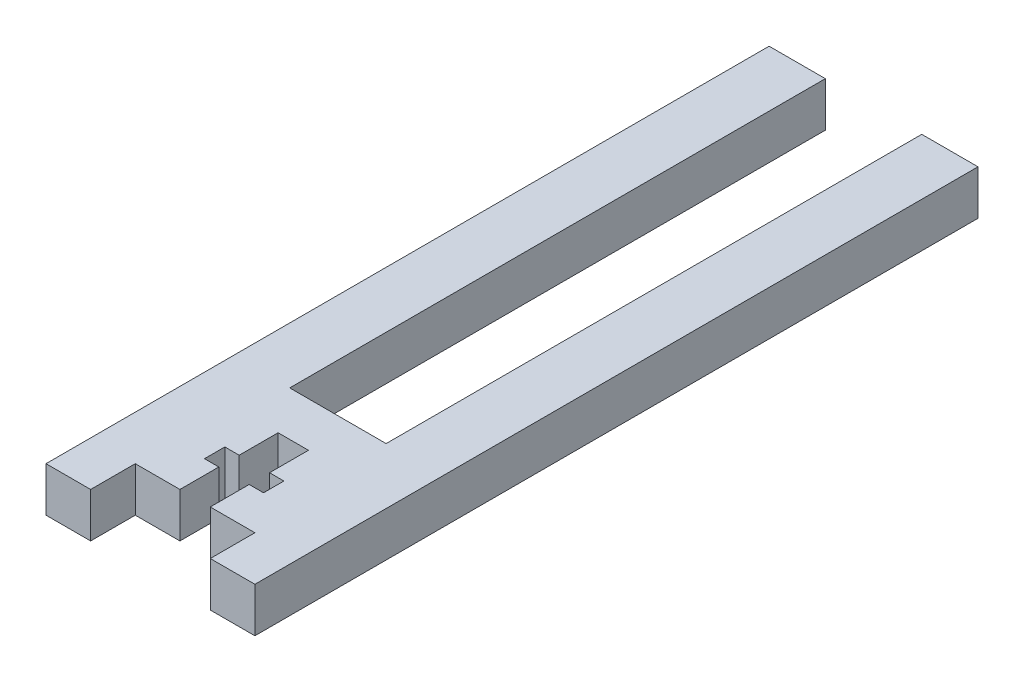
ISO-10303-21;
HEADER;
FILE_DESCRIPTION(('STEP AP214'),'2;1');
FILE_NAME('part.step','',(''),(''),'','','');
FILE_SCHEMA(('AUTOMOTIVE_DESIGN { 1 0 10303 214 1 1 1 1 }'));
ENDSEC;
DATA;
#1=APPLICATION_CONTEXT('core data for automotive mechanical design processes');
#2=APPLICATION_PROTOCOL_DEFINITION('international standard','automotive_design',2000,#1);
#3=PRODUCT_CONTEXT('',#1,'mechanical');
#4=PRODUCT('Part','Part','',(#3));
#5=PRODUCT_RELATED_PRODUCT_CATEGORY('part','',(#4));
#6=PRODUCT_DEFINITION_FORMATION('','',#4);
#7=PRODUCT_DEFINITION_CONTEXT('part definition',#1,'design');
#8=PRODUCT_DEFINITION('design','',#6,#7);
#9=PRODUCT_DEFINITION_SHAPE('','',#8);
#10=(LENGTH_UNIT() NAMED_UNIT(*) SI_UNIT(.MILLI.,.METRE.));
#11=(NAMED_UNIT(*) PLANE_ANGLE_UNIT() SI_UNIT($,.RADIAN.));
#12=(NAMED_UNIT(*) SI_UNIT($,.STERADIAN.) SOLID_ANGLE_UNIT());
#13=UNCERTAINTY_MEASURE_WITH_UNIT(LENGTH_MEASURE(1.E-05),#10,'distance_accuracy_value','');
#14=(GEOMETRIC_REPRESENTATION_CONTEXT(3) GLOBAL_UNCERTAINTY_ASSIGNED_CONTEXT((#13)) GLOBAL_UNIT_ASSIGNED_CONTEXT((#10,
#11,#12)) REPRESENTATION_CONTEXT('',''));
#15=CARTESIAN_POINT('',(0.,0.,0.));
#16=DIRECTION('',(0.,0.,1.));
#17=DIRECTION('',(1.,0.,0.));
#18=AXIS2_PLACEMENT_3D('',#15,#16,#17);
#19=CARTESIAN_POINT('',(0.,6.35,13.97));
#20=DIRECTION('',(0.,0.,1.));
#21=DIRECTION('',(1.,0.,0.));
#22=AXIS2_PLACEMENT_3D('',#19,#20,#21);
#23=PLANE('',#22);
#24=DIRECTION('',(-1.,0.,0.));
#25=VECTOR('',#24,1.);
#26=CARTESIAN_POINT('',(0.,0.,13.97));
#27=LINE('',#26,#25);
#28=CARTESIAN_POINT('',(8.50900000000017,0.,13.9699999999999));
#29=VERTEX_POINT('',#28);
#30=CARTESIAN_POINT('',(2.15900000000017,0.,13.97));
#31=VERTEX_POINT('',#30);
#32=EDGE_CURVE('E222',#29,#31,#27,.T.);
#33=ORIENTED_EDGE('',*,*,#32,.F.);
#34=DIRECTION('',(0.,-1.,0.));
#35=VECTOR('',#34,1.);
#36=CARTESIAN_POINT('',(8.50900000000017,6.35,13.9699999999999));
#37=LINE('',#36,#35);
#38=CARTESIAN_POINT('',(8.50900000000017,6.35,13.9699999999999));
#39=VERTEX_POINT('',#38);
#40=EDGE_CURVE('E11',#39,#29,#37,.T.);
#41=ORIENTED_EDGE('',*,*,#40,.F.);
#42=DIRECTION('',(-1.,0.,0.));
#43=VECTOR('',#42,1.);
#44=CARTESIAN_POINT('',(0.,6.35,13.97));
#45=LINE('',#44,#43);
#46=CARTESIAN_POINT('',(2.15900000000017,6.35,13.97));
#47=VERTEX_POINT('',#46);
#48=EDGE_CURVE('E278',#39,#47,#45,.T.);
#49=ORIENTED_EDGE('',*,*,#48,.T.);
#50=DIRECTION('',(0.,-1.,0.));
#51=VECTOR('',#50,1.);
#52=CARTESIAN_POINT('',(2.15900000000017,6.35,13.97));
#53=LINE('',#52,#51);
#54=EDGE_CURVE('E132',#47,#31,#53,.T.);
#55=ORIENTED_EDGE('',*,*,#54,.T.);
#56=EDGE_LOOP('',(#33,#41,#49,#55));
#57=FACE_BOUND('',#56,.T.);
#58=ADVANCED_FACE('F33',(#57),#23,.T.);
#59=CARTESIAN_POINT('',(8.50900000000008,6.35,0.));
#60=DIRECTION('',(1.,0.,0.));
#61=DIRECTION('',(0.,0.,-1.));
#62=AXIS2_PLACEMENT_3D('',#59,#60,#61);
#63=PLANE('',#62);
#64=DIRECTION('',(0.,0.,1.));
#65=VECTOR('',#64,1.);
#66=CARTESIAN_POINT('',(8.50900000000008,0.,0.));
#67=LINE('',#66,#65);
#68=CARTESIAN_POINT('',(8.50900000000021,0.,20.3199999999999));
#69=VERTEX_POINT('',#68);
#70=EDGE_CURVE('E225',#29,#69,#67,.T.);
#71=ORIENTED_EDGE('',*,*,#70,.T.);
#72=DIRECTION('',(0.,-1.,0.));
#73=VECTOR('',#72,1.);
#74=CARTESIAN_POINT('',(8.50900000000021,6.35,20.3199999999999));
#75=LINE('',#74,#73);
#76=CARTESIAN_POINT('',(8.50900000000021,6.35,20.3199999999999));
#77=VERTEX_POINT('',#76);
#78=EDGE_CURVE('E41',#77,#69,#75,.T.);
#79=ORIENTED_EDGE('',*,*,#78,.F.);
#80=DIRECTION('',(0.,0.,1.));
#81=VECTOR('',#80,1.);
#82=CARTESIAN_POINT('',(8.50900000000008,6.35,0.));
#83=LINE('',#82,#81);
#84=EDGE_CURVE('E351',#39,#77,#83,.T.);
#85=ORIENTED_EDGE('',*,*,#84,.F.);
#86=ORIENTED_EDGE('',*,*,#40,.T.);
#87=EDGE_LOOP('',(#71,#79,#85,#86));
#88=FACE_BOUND('',#87,.T.);
#89=ADVANCED_FACE('F404',(#88),#63,.F.);
#90=CARTESIAN_POINT('',(1.55431223447522E-13,6.35,20.32));
#91=DIRECTION('',(0.,0.,-1.));
#92=DIRECTION('',(-1.,0.,0.));
#93=AXIS2_PLACEMENT_3D('',#90,#91,#92);
#94=PLANE('',#93);
#95=DIRECTION('',(1.,0.,0.));
#96=VECTOR('',#95,1.);
#97=CARTESIAN_POINT('',(1.55431223447522E-13,0.,20.32));
#98=LINE('',#97,#96);
#99=CARTESIAN_POINT('',(14.8590000000002,0.,20.3199999999999));
#100=VERTEX_POINT('',#99);
#101=EDGE_CURVE('E227',#69,#100,#98,.T.);
#102=ORIENTED_EDGE('',*,*,#101,.T.);
#103=DIRECTION('',(0.,-1.,0.));
#104=VECTOR('',#103,1.);
#105=CARTESIAN_POINT('',(14.8590000000002,6.35,20.3199999999999));
#106=LINE('',#105,#104);
#107=CARTESIAN_POINT('',(14.8590000000002,6.35,20.3199999999999));
#108=VERTEX_POINT('',#107);
#109=EDGE_CURVE('E324',#108,#100,#106,.T.);
#110=ORIENTED_EDGE('',*,*,#109,.F.);
#111=DIRECTION('',(1.,0.,0.));
#112=VECTOR('',#111,1.);
#113=CARTESIAN_POINT('',(1.55431223447522E-13,6.35,20.32));
#114=LINE('',#113,#112);
#115=EDGE_CURVE('E333',#77,#108,#114,.T.);
#116=ORIENTED_EDGE('',*,*,#115,.F.);
#117=ORIENTED_EDGE('',*,*,#78,.T.);
#118=EDGE_LOOP('',(#102,#110,#116,#117));
#119=FACE_BOUND('',#118,.T.);
#120=ADVANCED_FACE('F331',(#119),#94,.F.);
#121=CARTESIAN_POINT('',(14.8590000000001,6.35,-1.13659082146001E-13));
#122=DIRECTION('',(-1.,0.,0.));
#123=DIRECTION('',(0.,0.,1.));
#124=AXIS2_PLACEMENT_3D('',#121,#122,#123);
#125=PLANE('',#124);
#126=DIRECTION('',(0.,0.,-1.));
#127=VECTOR('',#126,1.);
#128=CARTESIAN_POINT('',(14.8590000000001,0.,-1.13659082146001E-13));
#129=LINE('',#128,#127);
#130=CARTESIAN_POINT('',(14.8590000000009,0.,-82.55));
#131=VERTEX_POINT('',#130);
#132=EDGE_CURVE('E229',#100,#131,#129,.T.);
#133=ORIENTED_EDGE('',*,*,#132,.T.);
#134=DIRECTION('',(0.,-1.,0.));
#135=VECTOR('',#134,1.);
#136=CARTESIAN_POINT('',(14.8590000000009,6.35,-82.55));
#137=LINE('',#136,#135);
#138=CARTESIAN_POINT('',(14.8590000000009,6.35,-82.55));
#139=VERTEX_POINT('',#138);
#140=EDGE_CURVE('E322',#139,#131,#137,.T.);
#141=ORIENTED_EDGE('',*,*,#140,.F.);
#142=DIRECTION('',(0.,0.,-1.));
#143=VECTOR('',#142,1.);
#144=CARTESIAN_POINT('',(14.8590000000001,6.35,-1.13659082146001E-13));
#145=LINE('',#144,#143);
#146=EDGE_CURVE('E345',#108,#139,#145,.T.);
#147=ORIENTED_EDGE('',*,*,#146,.F.);
#148=ORIENTED_EDGE('',*,*,#109,.T.);
#149=EDGE_LOOP('',(#133,#141,#147,#148));
#150=FACE_BOUND('',#149,.T.);
#151=ADVANCED_FACE('F342',(#150),#125,.F.);
#152=CARTESIAN_POINT('',(0.,6.35,-82.55));
#153=DIRECTION('',(0.,0.,-1.));
#154=DIRECTION('',(-1.,0.,0.));
#155=AXIS2_PLACEMENT_3D('',#152,#153,#154);
#156=PLANE('',#155);
#157=DIRECTION('',(1.,0.,0.));
#158=VECTOR('',#157,1.);
#159=CARTESIAN_POINT('',(0.,0.,-82.55));
#160=LINE('',#159,#158);
#161=CARTESIAN_POINT('',(6.85800000000044,0.,-82.55));
#162=VERTEX_POINT('',#161);
#163=EDGE_CURVE('E232',#162,#131,#160,.T.);
#164=ORIENTED_EDGE('',*,*,#163,.F.);
#165=DIRECTION('',(0.,-1.,0.));
#166=VECTOR('',#165,1.);
#167=CARTESIAN_POINT('',(6.85800000000044,6.35,-82.55));
#168=LINE('',#167,#166);
#169=CARTESIAN_POINT('',(6.85800000000044,6.35,-82.55));
#170=VERTEX_POINT('',#169);
#171=EDGE_CURVE('E320',#170,#162,#168,.T.);
#172=ORIENTED_EDGE('',*,*,#171,.F.);
#173=DIRECTION('',(1.,0.,0.));
#174=VECTOR('',#173,1.);
#175=CARTESIAN_POINT('',(0.,6.35,-82.55));
#176=LINE('',#175,#174);
#177=EDGE_CURVE('E347',#170,#139,#176,.T.);
#178=ORIENTED_EDGE('',*,*,#177,.T.);
#179=ORIENTED_EDGE('',*,*,#140,.T.);
#180=EDGE_LOOP('',(#164,#172,#178,#179));
#181=FACE_BOUND('',#180,.T.);
#182=ADVANCED_FACE('F414',(#181),#156,.T.);
#183=CARTESIAN_POINT('',(6.85800000000046,6.35,0.));
#184=DIRECTION('',(-1.,0.,0.));
#185=DIRECTION('',(0.,0.,1.));
#186=AXIS2_PLACEMENT_3D('',#183,#184,#185);
#187=PLANE('',#186);
#188=DIRECTION('',(0.,0.,-1.));
#189=VECTOR('',#188,1.);
#190=CARTESIAN_POINT('',(6.85800000000046,0.,0.));
#191=LINE('',#190,#189);
#192=CARTESIAN_POINT('',(6.85800000000046,0.,-6.35000000000002));
#193=VERTEX_POINT('',#192);
#194=EDGE_CURVE('E235',#193,#162,#191,.T.);
#195=ORIENTED_EDGE('',*,*,#194,.F.);
#196=DIRECTION('',(0.,-1.,0.));
#197=VECTOR('',#196,1.);
#198=CARTESIAN_POINT('',(6.85800000000046,6.35,-6.35000000000002));
#199=LINE('',#198,#197);
#200=CARTESIAN_POINT('',(6.85800000000046,6.35,-6.35000000000002));
#201=VERTEX_POINT('',#200);
#202=EDGE_CURVE('E318',#201,#193,#199,.T.);
#203=ORIENTED_EDGE('',*,*,#202,.F.);
#204=DIRECTION('',(0.,0.,-1.));
#205=VECTOR('',#204,1.);
#206=CARTESIAN_POINT('',(6.85800000000046,6.35,0.));
#207=LINE('',#206,#205);
#208=EDGE_CURVE('E349',#201,#170,#207,.T.);
#209=ORIENTED_EDGE('',*,*,#208,.T.);
#210=ORIENTED_EDGE('',*,*,#171,.T.);
#211=EDGE_LOOP('',(#195,#203,#209,#210));
#212=FACE_BOUND('',#211,.T.);
#213=ADVANCED_FACE('F417',(#212),#187,.T.);
#214=CARTESIAN_POINT('',(0.,6.35,-6.35000000000002));
#215=DIRECTION('',(0.,0.,-1.));
#216=DIRECTION('',(-1.,0.,0.));
#217=AXIS2_PLACEMENT_3D('',#214,#215,#216);
#218=PLANE('',#217);
#219=DIRECTION('',(1.,0.,0.));
#220=VECTOR('',#219,1.);
#221=CARTESIAN_POINT('',(0.,0.,-6.35000000000002));
#222=LINE('',#221,#220);
#223=CARTESIAN_POINT('',(-6.85799999999954,0.,-6.35000000000002));
#224=VERTEX_POINT('',#223);
#225=EDGE_CURVE('E238',#224,#193,#222,.T.);
#226=ORIENTED_EDGE('',*,*,#225,.F.);
#227=DIRECTION('',(0.,-1.,0.));
#228=VECTOR('',#227,1.);
#229=CARTESIAN_POINT('',(-6.85799999999954,6.35,-6.35000000000002));
#230=LINE('',#229,#228);
#231=CARTESIAN_POINT('',(-6.85799999999954,6.35,-6.35000000000002));
#232=VERTEX_POINT('',#231);
#233=EDGE_CURVE('E316',#232,#224,#230,.T.);
#234=ORIENTED_EDGE('',*,*,#233,.F.);
#235=DIRECTION('',(1.,0.,0.));
#236=VECTOR('',#235,1.);
#237=CARTESIAN_POINT('',(0.,6.35,-6.35000000000002));
#238=LINE('',#237,#236);
#239=EDGE_CURVE('E357',#232,#201,#238,.T.);
#240=ORIENTED_EDGE('',*,*,#239,.T.);
#241=ORIENTED_EDGE('',*,*,#202,.T.);
#242=EDGE_LOOP('',(#226,#234,#240,#241));
#243=FACE_BOUND('',#242,.T.);
#244=ADVANCED_FACE('F421',(#243),#218,.T.);
#245=CARTESIAN_POINT('',(-6.85799999999954,6.35,0.));
#246=DIRECTION('',(1.,0.,0.));
#247=DIRECTION('',(0.,0.,-1.));
#248=AXIS2_PLACEMENT_3D('',#245,#246,#247);
#249=PLANE('',#248);
#250=DIRECTION('',(0.,0.,1.));
#251=VECTOR('',#250,1.);
#252=CARTESIAN_POINT('',(-6.85799999999954,0.,0.));
#253=LINE('',#252,#251);
#254=CARTESIAN_POINT('',(-6.85799999999956,0.,-82.55));
#255=VERTEX_POINT('',#254);
#256=EDGE_CURVE('E241',#255,#224,#253,.T.);
#257=ORIENTED_EDGE('',*,*,#256,.F.);
#258=DIRECTION('',(0.,-1.,0.));
#259=VECTOR('',#258,1.);
#260=CARTESIAN_POINT('',(-6.85799999999956,6.35,-82.55));
#261=LINE('',#260,#259);
#262=CARTESIAN_POINT('',(-6.85799999999956,6.35,-82.55));
#263=VERTEX_POINT('',#262);
#264=EDGE_CURVE('E314',#263,#255,#261,.T.);
#265=ORIENTED_EDGE('',*,*,#264,.F.);
#266=DIRECTION('',(0.,0.,1.));
#267=VECTOR('',#266,1.);
#268=CARTESIAN_POINT('',(-6.85799999999954,6.35,0.));
#269=LINE('',#268,#267);
#270=EDGE_CURVE('E360',#263,#232,#269,.T.);
#271=ORIENTED_EDGE('',*,*,#270,.T.);
#272=ORIENTED_EDGE('',*,*,#233,.T.);
#273=EDGE_LOOP('',(#257,#265,#271,#272));
#274=FACE_BOUND('',#273,.T.);
#275=ADVANCED_FACE('F425',(#274),#249,.T.);
#276=CARTESIAN_POINT('',(0.,6.35,-82.55));
#277=DIRECTION('',(0.,0.,-1.));
#278=DIRECTION('',(-1.,0.,0.));
#279=AXIS2_PLACEMENT_3D('',#276,#277,#278);
#280=PLANE('',#279);
#281=DIRECTION('',(1.,0.,0.));
#282=VECTOR('',#281,1.);
#283=CARTESIAN_POINT('',(0.,0.,-82.55));
#284=LINE('',#283,#282);
#285=CARTESIAN_POINT('',(-14.859,0.,-82.55));
#286=VERTEX_POINT('',#285);
#287=EDGE_CURVE('E244',#286,#255,#284,.T.);
#288=ORIENTED_EDGE('',*,*,#287,.F.);
#289=DIRECTION('',(0.,-1.,0.));
#290=VECTOR('',#289,1.);
#291=CARTESIAN_POINT('',(-14.859,6.35,-82.55));
#292=LINE('',#291,#290);
#293=CARTESIAN_POINT('',(-14.859,6.35,-82.55));
#294=VERTEX_POINT('',#293);
#295=EDGE_CURVE('E312',#294,#286,#292,.T.);
#296=ORIENTED_EDGE('',*,*,#295,.F.);
#297=DIRECTION('',(1.,0.,0.));
#298=VECTOR('',#297,1.);
#299=CARTESIAN_POINT('',(0.,6.35,-82.55));
#300=LINE('',#299,#298);
#301=EDGE_CURVE('E363',#294,#263,#300,.T.);
#302=ORIENTED_EDGE('',*,*,#301,.T.);
#303=ORIENTED_EDGE('',*,*,#264,.T.);
#304=EDGE_LOOP('',(#288,#296,#302,#303));
#305=FACE_BOUND('',#304,.T.);
#306=ADVANCED_FACE('F429',(#305),#280,.T.);
#307=CARTESIAN_POINT('',(-14.859,6.35,0.));
#308=DIRECTION('',(-1.,0.,0.));
#309=DIRECTION('',(0.,0.,1.));
#310=AXIS2_PLACEMENT_3D('',#307,#308,#309);
#311=PLANE('',#310);
#312=DIRECTION('',(0.,0.,-1.));
#313=VECTOR('',#312,1.);
#314=CARTESIAN_POINT('',(-14.859,0.,0.));
#315=LINE('',#314,#313);
#316=CARTESIAN_POINT('',(-14.8589999999998,0.,20.3200000000001));
#317=VERTEX_POINT('',#316);
#318=EDGE_CURVE('E247',#317,#286,#315,.T.);
#319=ORIENTED_EDGE('',*,*,#318,.F.);
#320=DIRECTION('',(0.,-1.,0.));
#321=VECTOR('',#320,1.);
#322=CARTESIAN_POINT('',(-14.8589999999998,6.35,20.3200000000001));
#323=LINE('',#322,#321);
#324=CARTESIAN_POINT('',(-14.8589999999998,6.35,20.3200000000001));
#325=VERTEX_POINT('',#324);
#326=EDGE_CURVE('E310',#325,#317,#323,.T.);
#327=ORIENTED_EDGE('',*,*,#326,.F.);
#328=DIRECTION('',(0.,0.,-1.));
#329=VECTOR('',#328,1.);
#330=CARTESIAN_POINT('',(-14.859,6.35,0.));
#331=LINE('',#330,#329);
#332=EDGE_CURVE('E366',#325,#294,#331,.T.);
#333=ORIENTED_EDGE('',*,*,#332,.T.);
#334=ORIENTED_EDGE('',*,*,#295,.T.);
#335=EDGE_LOOP('',(#319,#327,#333,#334));
#336=FACE_BOUND('',#335,.T.);
#337=ADVANCED_FACE('F433',(#336),#311,.T.);
#338=CARTESIAN_POINT('',(1.4432899320127E-13,6.35,20.32));
#339=DIRECTION('',(0.,0.,1.));
#340=DIRECTION('',(1.,0.,0.));
#341=AXIS2_PLACEMENT_3D('',#338,#339,#340);
#342=PLANE('',#341);
#343=DIRECTION('',(-1.,0.,0.));
#344=VECTOR('',#343,1.);
#345=CARTESIAN_POINT('',(1.4432899320127E-13,0.,20.32));
#346=LINE('',#345,#344);
#347=CARTESIAN_POINT('',(-8.50899999999977,0.,20.32));
#348=VERTEX_POINT('',#347);
#349=EDGE_CURVE('E250',#348,#317,#346,.T.);
#350=ORIENTED_EDGE('',*,*,#349,.F.);
#351=DIRECTION('',(0.,-1.,0.));
#352=VECTOR('',#351,1.);
#353=CARTESIAN_POINT('',(-8.50899999999977,6.35,20.32));
#354=LINE('',#353,#352);
#355=CARTESIAN_POINT('',(-8.50899999999977,6.35,20.32));
#356=VERTEX_POINT('',#355);
#357=EDGE_CURVE('E308',#356,#348,#354,.T.);
#358=ORIENTED_EDGE('',*,*,#357,.F.);
#359=DIRECTION('',(-1.,0.,0.));
#360=VECTOR('',#359,1.);
#361=CARTESIAN_POINT('',(1.4432899320127E-13,6.35,20.32));
#362=LINE('',#361,#360);
#363=EDGE_CURVE('E369',#356,#325,#362,.T.);
#364=ORIENTED_EDGE('',*,*,#363,.T.);
#365=ORIENTED_EDGE('',*,*,#326,.T.);
#366=EDGE_LOOP('',(#350,#358,#364,#365));
#367=FACE_BOUND('',#366,.T.);
#368=ADVANCED_FACE('F437',(#367),#342,.T.);
#369=CARTESIAN_POINT('',(-8.50899999999993,6.35,0.));
#370=DIRECTION('',(1.,0.,0.));
#371=DIRECTION('',(0.,0.,-1.));
#372=AXIS2_PLACEMENT_3D('',#369,#370,#371);
#373=PLANE('',#372);
#374=DIRECTION('',(0.,0.,1.));
#375=VECTOR('',#374,1.);
#376=CARTESIAN_POINT('',(-8.50899999999993,0.,0.));
#377=LINE('',#376,#375);
#378=CARTESIAN_POINT('',(-8.50899999999982,0.,13.97));
#379=VERTEX_POINT('',#378);
#380=EDGE_CURVE('E253',#379,#348,#377,.T.);
#381=ORIENTED_EDGE('',*,*,#380,.F.);
#382=DIRECTION('',(0.,-1.,0.));
#383=VECTOR('',#382,1.);
#384=CARTESIAN_POINT('',(-8.50899999999982,6.35,13.97));
#385=LINE('',#384,#383);
#386=CARTESIAN_POINT('',(-8.50899999999982,6.35,13.97));
#387=VERTEX_POINT('',#386);
#388=EDGE_CURVE('E306',#387,#379,#385,.T.);
#389=ORIENTED_EDGE('',*,*,#388,.F.);
#390=DIRECTION('',(0.,0.,1.));
#391=VECTOR('',#390,1.);
#392=CARTESIAN_POINT('',(-8.50899999999993,6.35,0.));
#393=LINE('',#392,#391);
#394=EDGE_CURVE('E372',#387,#356,#393,.T.);
#395=ORIENTED_EDGE('',*,*,#394,.T.);
#396=ORIENTED_EDGE('',*,*,#357,.T.);
#397=EDGE_LOOP('',(#381,#389,#395,#396));
#398=FACE_BOUND('',#397,.T.);
#399=ADVANCED_FACE('F441',(#398),#373,.T.);
#400=CARTESIAN_POINT('',(0.,6.35,13.97));
#401=DIRECTION('',(0.,0.,-1.));
#402=DIRECTION('',(-1.,0.,0.));
#403=AXIS2_PLACEMENT_3D('',#400,#401,#402);
#404=PLANE('',#403);
#405=DIRECTION('',(1.,0.,0.));
#406=VECTOR('',#405,1.);
#407=CARTESIAN_POINT('',(0.,0.,13.97));
#408=LINE('',#407,#406);
#409=CARTESIAN_POINT('',(-2.15899999999983,0.,13.97));
#410=VERTEX_POINT('',#409);
#411=EDGE_CURVE('E256',#379,#410,#408,.T.);
#412=ORIENTED_EDGE('',*,*,#411,.T.);
#413=DIRECTION('',(0.,-1.,0.));
#414=VECTOR('',#413,1.);
#415=CARTESIAN_POINT('',(-2.15899999999983,6.35,13.97));
#416=LINE('',#415,#414);
#417=CARTESIAN_POINT('',(-2.15899999999983,6.35,13.97));
#418=VERTEX_POINT('',#417);
#419=EDGE_CURVE('E303',#418,#410,#416,.T.);
#420=ORIENTED_EDGE('',*,*,#419,.F.);
#421=DIRECTION('',(1.,0.,0.));
#422=VECTOR('',#421,1.);
#423=CARTESIAN_POINT('',(0.,6.35,13.97));
#424=LINE('',#423,#422);
#425=EDGE_CURVE('E375',#387,#418,#424,.T.);
#426=ORIENTED_EDGE('',*,*,#425,.F.);
#427=ORIENTED_EDGE('',*,*,#388,.T.);
#428=EDGE_LOOP('',(#412,#420,#426,#427));
#429=FACE_BOUND('',#428,.T.);
#430=ADVANCED_FACE('F445',(#429),#404,.F.);
#431=CARTESIAN_POINT('',(-2.15899999999991,6.35,0.));
#432=DIRECTION('',(-1.,0.,0.));
#433=DIRECTION('',(0.,0.,1.));
#434=AXIS2_PLACEMENT_3D('',#431,#432,#433);
#435=PLANE('',#434);
#436=DIRECTION('',(0.,0.,-1.));
#437=VECTOR('',#436,1.);
#438=CARTESIAN_POINT('',(-2.15899999999991,0.,0.));
#439=LINE('',#438,#437);
#440=CARTESIAN_POINT('',(-2.15899999999986,0.,8.43500002099998));
#441=VERTEX_POINT('',#440);
#442=EDGE_CURVE('E258',#410,#441,#439,.T.);
#443=ORIENTED_EDGE('',*,*,#442,.T.);
#444=DIRECTION('',(0.,-1.,0.));
#445=VECTOR('',#444,1.);
#446=CARTESIAN_POINT('',(-2.15899999999986,6.35,8.43500002099998));
#447=LINE('',#446,#445);
#448=CARTESIAN_POINT('',(-2.15899999999986,6.35,8.43500002099998));
#449=VERTEX_POINT('',#448);
#450=EDGE_CURVE('E300',#449,#441,#447,.T.);
#451=ORIENTED_EDGE('',*,*,#450,.F.);
#452=DIRECTION('',(0.,0.,-1.));
#453=VECTOR('',#452,1.);
#454=CARTESIAN_POINT('',(-2.15899999999991,6.35,0.));
#455=LINE('',#454,#453);
#456=EDGE_CURVE('E377',#418,#449,#455,.T.);
#457=ORIENTED_EDGE('',*,*,#456,.F.);
#458=ORIENTED_EDGE('',*,*,#419,.T.);
#459=EDGE_LOOP('',(#443,#451,#457,#458));
#460=FACE_BOUND('',#459,.T.);
#461=ADVANCED_FACE('F449',(#460),#435,.F.);
#462=CARTESIAN_POINT('',(0.,6.35,8.43500002099997));
#463=DIRECTION('',(0.,0.,1.));
#464=DIRECTION('',(1.,0.,0.));
#465=AXIS2_PLACEMENT_3D('',#462,#463,#464);
#466=PLANE('',#465);
#467=DIRECTION('',(-1.,0.,0.));
#468=VECTOR('',#467,1.);
#469=CARTESIAN_POINT('',(0.,0.,8.43500002099997));
#470=LINE('',#469,#468);
#471=CARTESIAN_POINT('',(-4.19999998199986,0.,8.435000021));
#472=VERTEX_POINT('',#471);
#473=EDGE_CURVE('E260',#441,#472,#470,.T.);
#474=ORIENTED_EDGE('',*,*,#473,.T.);
#475=DIRECTION('',(0.,-1.,0.));
#476=VECTOR('',#475,1.);
#477=CARTESIAN_POINT('',(-4.19999998199986,6.35,8.435000021));
#478=LINE('',#477,#476);
#479=CARTESIAN_POINT('',(-4.19999998199986,6.35,8.435000021));
#480=VERTEX_POINT('',#479);
#481=EDGE_CURVE('E297',#480,#472,#478,.T.);
#482=ORIENTED_EDGE('',*,*,#481,.F.);
#483=DIRECTION('',(-1.,0.,0.));
#484=VECTOR('',#483,1.);
#485=CARTESIAN_POINT('',(0.,6.35,8.43500002099997));
#486=LINE('',#485,#484);
#487=EDGE_CURVE('E379',#449,#480,#486,.T.);
#488=ORIENTED_EDGE('',*,*,#487,.F.);
#489=ORIENTED_EDGE('',*,*,#450,.T.);
#490=EDGE_LOOP('',(#474,#482,#488,#489));
#491=FACE_BOUND('',#490,.T.);
#492=ADVANCED_FACE('F453',(#491),#466,.F.);
#493=CARTESIAN_POINT('',(-4.19999998199992,6.35,0.));
#494=DIRECTION('',(-1.,0.,0.));
#495=DIRECTION('',(0.,0.,1.));
#496=AXIS2_PLACEMENT_3D('',#493,#494,#495);
#497=PLANE('',#496);
#498=DIRECTION('',(0.,0.,-1.));
#499=VECTOR('',#498,1.);
#500=CARTESIAN_POINT('',(-4.19999998199992,0.,0.));
#501=LINE('',#500,#499);
#502=CARTESIAN_POINT('',(-4.19999998199988,0.,5.534999979));
#503=VERTEX_POINT('',#502);
#504=EDGE_CURVE('E262',#472,#503,#501,.T.);
#505=ORIENTED_EDGE('',*,*,#504,.T.);
#506=DIRECTION('',(0.,-1.,0.));
#507=VECTOR('',#506,1.);
#508=CARTESIAN_POINT('',(-4.19999998199988,6.35,5.534999979));
#509=LINE('',#508,#507);
#510=CARTESIAN_POINT('',(-4.19999998199988,6.35,5.534999979));
#511=VERTEX_POINT('',#510);
#512=EDGE_CURVE('E294',#511,#503,#509,.T.);
#513=ORIENTED_EDGE('',*,*,#512,.F.);
#514=DIRECTION('',(0.,0.,-1.));
#515=VECTOR('',#514,1.);
#516=CARTESIAN_POINT('',(-4.19999998199992,6.35,0.));
#517=LINE('',#516,#515);
#518=EDGE_CURVE('E381',#480,#511,#517,.T.);
#519=ORIENTED_EDGE('',*,*,#518,.F.);
#520=ORIENTED_EDGE('',*,*,#481,.T.);
#521=EDGE_LOOP('',(#505,#513,#519,#520));
#522=FACE_BOUND('',#521,.T.);
#523=ADVANCED_FACE('F457',(#522),#497,.F.);
#524=CARTESIAN_POINT('',(0.,6.35,5.53499997899996));
#525=DIRECTION('',(0.,0.,-1.));
#526=DIRECTION('',(-1.,0.,0.));
#527=AXIS2_PLACEMENT_3D('',#524,#525,#526);
#528=PLANE('',#527);
#529=DIRECTION('',(1.,0.,0.));
#530=VECTOR('',#529,1.);
#531=CARTESIAN_POINT('',(0.,0.,5.53499997899996));
#532=LINE('',#531,#530);
#533=CARTESIAN_POINT('',(-2.15899999999988,0.,5.53499997899998));
#534=VERTEX_POINT('',#533);
#535=EDGE_CURVE('E264',#503,#534,#532,.T.);
#536=ORIENTED_EDGE('',*,*,#535,.T.);
#537=DIRECTION('',(0.,-1.,0.));
#538=VECTOR('',#537,1.);
#539=CARTESIAN_POINT('',(-2.15899999999988,6.35,5.53499997899998));
#540=LINE('',#539,#538);
#541=CARTESIAN_POINT('',(-2.15899999999988,6.35,5.53499997899998));
#542=VERTEX_POINT('',#541);
#543=EDGE_CURVE('E291',#542,#534,#540,.T.);
#544=ORIENTED_EDGE('',*,*,#543,.F.);
#545=DIRECTION('',(1.,0.,0.));
#546=VECTOR('',#545,1.);
#547=CARTESIAN_POINT('',(0.,6.35,5.53499997899996));
#548=LINE('',#547,#546);
#549=EDGE_CURVE('E383',#511,#542,#548,.T.);
#550=ORIENTED_EDGE('',*,*,#549,.F.);
#551=ORIENTED_EDGE('',*,*,#512,.T.);
#552=EDGE_LOOP('',(#536,#544,#550,#551));
#553=FACE_BOUND('',#552,.T.);
#554=ADVANCED_FACE('F461',(#553),#528,.F.);
#555=CARTESIAN_POINT('',(-2.15899999999992,6.35,0.));
#556=DIRECTION('',(-1.,0.,0.));
#557=DIRECTION('',(0.,0.,1.));
#558=AXIS2_PLACEMENT_3D('',#555,#556,#557);
#559=PLANE('',#558);
#560=DIRECTION('',(0.,0.,-1.));
#561=VECTOR('',#560,1.);
#562=CARTESIAN_POINT('',(-2.15899999999992,0.,0.));
#563=LINE('',#562,#561);
#564=CARTESIAN_POINT('',(-2.15899999999992,0.,0.));
#565=VERTEX_POINT('',#564);
#566=EDGE_CURVE('E266',#534,#565,#563,.T.);
#567=ORIENTED_EDGE('',*,*,#566,.T.);
#568=DIRECTION('',(0.,-1.,0.));
#569=VECTOR('',#568,1.);
#570=CARTESIAN_POINT('',(-2.15899999999992,6.35,0.));
#571=LINE('',#570,#569);
#572=CARTESIAN_POINT('',(-2.15899999999992,6.35,0.));
#573=VERTEX_POINT('',#572);
#574=EDGE_CURVE('E288',#573,#565,#571,.T.);
#575=ORIENTED_EDGE('',*,*,#574,.F.);
#576=DIRECTION('',(0.,0.,-1.));
#577=VECTOR('',#576,1.);
#578=CARTESIAN_POINT('',(-2.15899999999992,6.35,0.));
#579=LINE('',#578,#577);
#580=EDGE_CURVE('E385',#542,#573,#579,.T.);
#581=ORIENTED_EDGE('',*,*,#580,.F.);
#582=ORIENTED_EDGE('',*,*,#543,.T.);
#583=EDGE_LOOP('',(#567,#575,#581,#582));
#584=FACE_BOUND('',#583,.T.);
#585=ADVANCED_FACE('F465',(#584),#559,.F.);
#586=CARTESIAN_POINT('',(0.,6.35,0.));
#587=DIRECTION('',(0.,0.,-1.));
#588=DIRECTION('',(-1.,0.,0.));
#589=AXIS2_PLACEMENT_3D('',#586,#587,#588);
#590=PLANE('',#589);
#591=DIRECTION('',(1.,0.,0.));
#592=VECTOR('',#591,1.);
#593=CARTESIAN_POINT('',(0.,0.,0.));
#594=LINE('',#593,#592);
#595=CARTESIAN_POINT('',(2.15900000000007,0.,0.));
#596=VERTEX_POINT('',#595);
#597=EDGE_CURVE('E268',#565,#596,#594,.T.);
#598=ORIENTED_EDGE('',*,*,#597,.T.);
#599=DIRECTION('',(0.,-1.,0.));
#600=VECTOR('',#599,1.);
#601=CARTESIAN_POINT('',(2.15900000000007,6.35,0.));
#602=LINE('',#601,#600);
#603=CARTESIAN_POINT('',(2.15900000000007,6.35,0.));
#604=VERTEX_POINT('',#603);
#605=EDGE_CURVE('E285',#604,#596,#602,.T.);
#606=ORIENTED_EDGE('',*,*,#605,.F.);
#607=DIRECTION('',(1.,0.,0.));
#608=VECTOR('',#607,1.);
#609=CARTESIAN_POINT('',(0.,6.35,0.));
#610=LINE('',#609,#608);
#611=EDGE_CURVE('E387',#573,#604,#610,.T.);
#612=ORIENTED_EDGE('',*,*,#611,.F.);
#613=ORIENTED_EDGE('',*,*,#574,.T.);
#614=EDGE_LOOP('',(#598,#606,#612,#613));
#615=FACE_BOUND('',#614,.T.);
#616=ADVANCED_FACE('F469',(#615),#590,.F.);
#617=CARTESIAN_POINT('',(2.15900000000007,6.35,0.));
#618=DIRECTION('',(1.,0.,0.));
#619=DIRECTION('',(0.,0.,-1.));
#620=AXIS2_PLACEMENT_3D('',#617,#618,#619);
#621=PLANE('',#620);
#622=DIRECTION('',(0.,0.,1.));
#623=VECTOR('',#622,1.);
#624=CARTESIAN_POINT('',(2.15900000000007,0.,0.));
#625=LINE('',#624,#623);
#626=CARTESIAN_POINT('',(2.15900000000012,0.,5.53499997899995));
#627=VERTEX_POINT('',#626);
#628=EDGE_CURVE('E270',#596,#627,#625,.T.);
#629=ORIENTED_EDGE('',*,*,#628,.T.);
#630=DIRECTION('',(0.,-1.,0.));
#631=VECTOR('',#630,1.);
#632=CARTESIAN_POINT('',(2.15900000000012,6.35,5.53499997899995));
#633=LINE('',#632,#631);
#634=CARTESIAN_POINT('',(2.15900000000012,6.35,5.53499997899995));
#635=VERTEX_POINT('',#634);
#636=EDGE_CURVE('E282',#635,#627,#633,.T.);
#637=ORIENTED_EDGE('',*,*,#636,.F.);
#638=DIRECTION('',(0.,0.,1.));
#639=VECTOR('',#638,1.);
#640=CARTESIAN_POINT('',(2.15900000000007,6.35,0.));
#641=LINE('',#640,#639);
#642=EDGE_CURVE('E389',#604,#635,#641,.T.);
#643=ORIENTED_EDGE('',*,*,#642,.F.);
#644=ORIENTED_EDGE('',*,*,#605,.T.);
#645=EDGE_LOOP('',(#629,#637,#643,#644));
#646=FACE_BOUND('',#645,.T.);
#647=ADVANCED_FACE('F395',(#646),#621,.F.);
#648=CARTESIAN_POINT('',(0.,6.35,5.53499997899996));
#649=DIRECTION('',(0.,0.,-1.));
#650=DIRECTION('',(-1.,0.,0.));
#651=AXIS2_PLACEMENT_3D('',#648,#649,#650);
#652=PLANE('',#651);
#653=DIRECTION('',(1.,0.,0.));
#654=VECTOR('',#653,1.);
#655=CARTESIAN_POINT('',(0.,0.,5.53499997899996));
#656=LINE('',#655,#654);
#657=CARTESIAN_POINT('',(4.19999998200011,0.,5.53499997899994));
#658=VERTEX_POINT('',#657);
#659=EDGE_CURVE('E272',#627,#658,#656,.T.);
#660=ORIENTED_EDGE('',*,*,#659,.T.);
#661=DIRECTION('',(0.,-1.,0.));
#662=VECTOR('',#661,1.);
#663=CARTESIAN_POINT('',(4.19999998200011,6.35,5.53499997899994));
#664=LINE('',#663,#662);
#665=CARTESIAN_POINT('',(4.19999998200011,6.35,5.53499997899994));
#666=VERTEX_POINT('',#665);
#667=EDGE_CURVE('E214',#666,#658,#664,.T.);
#668=ORIENTED_EDGE('',*,*,#667,.F.);
#669=DIRECTION('',(1.,0.,0.));
#670=VECTOR('',#669,1.);
#671=CARTESIAN_POINT('',(0.,6.35,5.53499997899996));
#672=LINE('',#671,#670);
#673=EDGE_CURVE('E205',#635,#666,#672,.T.);
#674=ORIENTED_EDGE('',*,*,#673,.F.);
#675=ORIENTED_EDGE('',*,*,#636,.T.);
#676=EDGE_LOOP('',(#660,#668,#674,#675));
#677=FACE_BOUND('',#676,.T.);
#678=ADVANCED_FACE('F399',(#677),#652,.F.);
#679=CARTESIAN_POINT('',(4.19999998200005,6.35,0.));
#680=DIRECTION('',(1.,0.,0.));
#681=DIRECTION('',(0.,0.,-1.));
#682=AXIS2_PLACEMENT_3D('',#679,#680,#681);
#683=PLANE('',#682);
#684=DIRECTION('',(0.,0.,1.));
#685=VECTOR('',#684,1.);
#686=CARTESIAN_POINT('',(4.19999998200005,0.,0.));
#687=LINE('',#686,#685);
#688=CARTESIAN_POINT('',(4.19999998200014,0.,8.43500002099994));
#689=VERTEX_POINT('',#688);
#690=EDGE_CURVE('E213',#658,#689,#687,.T.);
#691=ORIENTED_EDGE('',*,*,#690,.T.);
#692=DIRECTION('',(0.,-1.,0.));
#693=VECTOR('',#692,1.);
#694=CARTESIAN_POINT('',(4.19999998200014,6.35,8.43500002099994));
#695=LINE('',#694,#693);
#696=CARTESIAN_POINT('',(4.19999998200014,6.35,8.43500002099994));
#697=VERTEX_POINT('',#696);
#698=EDGE_CURVE('E210',#697,#689,#695,.T.);
#699=ORIENTED_EDGE('',*,*,#698,.F.);
#700=DIRECTION('',(0.,0.,1.));
#701=VECTOR('',#700,1.);
#702=CARTESIAN_POINT('',(4.19999998200005,6.35,0.));
#703=LINE('',#702,#701);
#704=EDGE_CURVE('E199',#666,#697,#703,.T.);
#705=ORIENTED_EDGE('',*,*,#704,.F.);
#706=ORIENTED_EDGE('',*,*,#667,.T.);
#707=EDGE_LOOP('',(#691,#699,#705,#706));
#708=FACE_BOUND('',#707,.T.);
#709=ADVANCED_FACE('F211',(#708),#683,.F.);
#710=CARTESIAN_POINT('',(0.,6.35,8.43500002099996));
#711=DIRECTION('',(0.,0.,1.));
#712=DIRECTION('',(1.,0.,0.));
#713=AXIS2_PLACEMENT_3D('',#710,#711,#712);
#714=PLANE('',#713);
#715=DIRECTION('',(-1.,0.,0.));
#716=VECTOR('',#715,1.);
#717=CARTESIAN_POINT('',(0.,0.,8.43500002099996));
#718=LINE('',#717,#716);
#719=CARTESIAN_POINT('',(2.15900000000014,0.,8.43500002099995));
#720=VERTEX_POINT('',#719);
#721=EDGE_CURVE('E125',#689,#720,#718,.T.);
#722=ORIENTED_EDGE('',*,*,#721,.T.);
#723=DIRECTION('',(0.,-1.,0.));
#724=VECTOR('',#723,1.);
#725=CARTESIAN_POINT('',(2.15900000000014,6.35,8.43500002099995));
#726=LINE('',#725,#724);
#727=CARTESIAN_POINT('',(2.15900000000014,6.35,8.43500002099995));
#728=VERTEX_POINT('',#727);
#729=EDGE_CURVE('E215',#728,#720,#726,.T.);
#730=ORIENTED_EDGE('',*,*,#729,.F.);
#731=DIRECTION('',(-1.,0.,0.));
#732=VECTOR('',#731,1.);
#733=CARTESIAN_POINT('',(0.,6.35,8.43500002099996));
#734=LINE('',#733,#732);
#735=EDGE_CURVE('E203',#697,#728,#734,.T.);
#736=ORIENTED_EDGE('',*,*,#735,.F.);
#737=ORIENTED_EDGE('',*,*,#698,.T.);
#738=EDGE_LOOP('',(#722,#730,#736,#737));
#739=FACE_BOUND('',#738,.T.);
#740=ADVANCED_FACE('F217',(#739),#714,.F.);
#741=CARTESIAN_POINT('',(2.15900000000008,6.35,0.));
#742=DIRECTION('',(1.,0.,0.));
#743=DIRECTION('',(0.,0.,-1.));
#744=AXIS2_PLACEMENT_3D('',#741,#742,#743);
#745=PLANE('',#744);
#746=DIRECTION('',(0.,0.,1.));
#747=VECTOR('',#746,1.);
#748=CARTESIAN_POINT('',(2.15900000000008,0.,0.));
#749=LINE('',#748,#747);
#750=EDGE_CURVE('E276',#720,#31,#749,.T.);
#751=ORIENTED_EDGE('',*,*,#750,.T.);
#752=ORIENTED_EDGE('',*,*,#54,.F.);
#753=DIRECTION('',(0.,0.,1.));
#754=VECTOR('',#753,1.);
#755=CARTESIAN_POINT('',(2.15900000000008,6.35,0.));
#756=LINE('',#755,#754);
#757=EDGE_CURVE('E49',#728,#47,#756,.T.);
#758=ORIENTED_EDGE('',*,*,#757,.F.);
#759=ORIENTED_EDGE('',*,*,#729,.T.);
#760=EDGE_LOOP('',(#751,#752,#758,#759));
#761=FACE_BOUND('',#760,.T.);
#762=ADVANCED_FACE('F402',(#761),#745,.F.);
#763=CARTESIAN_POINT('',(0.,6.35,0.));
#764=DIRECTION('',(0.,1.,0.));
#765=DIRECTION('',(0.,0.,1.));
#766=AXIS2_PLACEMENT_3D('',#763,#764,#765);
#767=PLANE('',#766);
#768=ORIENTED_EDGE('',*,*,#48,.F.);
#769=ORIENTED_EDGE('',*,*,#84,.T.);
#770=ORIENTED_EDGE('',*,*,#115,.T.);
#771=ORIENTED_EDGE('',*,*,#146,.T.);
#772=ORIENTED_EDGE('',*,*,#177,.F.);
#773=ORIENTED_EDGE('',*,*,#208,.F.);
#774=ORIENTED_EDGE('',*,*,#239,.F.);
#775=ORIENTED_EDGE('',*,*,#270,.F.);
#776=ORIENTED_EDGE('',*,*,#301,.F.);
#777=ORIENTED_EDGE('',*,*,#332,.F.);
#778=ORIENTED_EDGE('',*,*,#363,.F.);
#779=ORIENTED_EDGE('',*,*,#394,.F.);
#780=ORIENTED_EDGE('',*,*,#425,.T.);
#781=ORIENTED_EDGE('',*,*,#456,.T.);
#782=ORIENTED_EDGE('',*,*,#487,.T.);
#783=ORIENTED_EDGE('',*,*,#518,.T.);
#784=ORIENTED_EDGE('',*,*,#549,.T.);
#785=ORIENTED_EDGE('',*,*,#580,.T.);
#786=ORIENTED_EDGE('',*,*,#611,.T.);
#787=ORIENTED_EDGE('',*,*,#642,.T.);
#788=ORIENTED_EDGE('',*,*,#673,.T.);
#789=ORIENTED_EDGE('',*,*,#704,.T.);
#790=ORIENTED_EDGE('',*,*,#735,.T.);
#791=ORIENTED_EDGE('',*,*,#757,.T.);
#792=EDGE_LOOP('',(#768,#769,#770,#771,#772,#773,#774,#775,#776,#777,#778,#779,#780,#781,#782,
#783,#784,#785,#786,#787,#788,#789,#790,#791));
#793=FACE_BOUND('',#792,.T.);
#794=ADVANCED_FACE('F201',(#793),#767,.T.);
#795=CARTESIAN_POINT('',(0.,0.,0.));
#796=DIRECTION('',(0.,1.,0.));
#797=DIRECTION('',(0.,0.,1.));
#798=AXIS2_PLACEMENT_3D('',#795,#796,#797);
#799=PLANE('',#798);
#800=ORIENTED_EDGE('',*,*,#32,.T.);
#801=ORIENTED_EDGE('',*,*,#750,.F.);
#802=ORIENTED_EDGE('',*,*,#721,.F.);
#803=ORIENTED_EDGE('',*,*,#690,.F.);
#804=ORIENTED_EDGE('',*,*,#659,.F.);
#805=ORIENTED_EDGE('',*,*,#628,.F.);
#806=ORIENTED_EDGE('',*,*,#597,.F.);
#807=ORIENTED_EDGE('',*,*,#566,.F.);
#808=ORIENTED_EDGE('',*,*,#535,.F.);
#809=ORIENTED_EDGE('',*,*,#504,.F.);
#810=ORIENTED_EDGE('',*,*,#473,.F.);
#811=ORIENTED_EDGE('',*,*,#442,.F.);
#812=ORIENTED_EDGE('',*,*,#411,.F.);
#813=ORIENTED_EDGE('',*,*,#380,.T.);
#814=ORIENTED_EDGE('',*,*,#349,.T.);
#815=ORIENTED_EDGE('',*,*,#318,.T.);
#816=ORIENTED_EDGE('',*,*,#287,.T.);
#817=ORIENTED_EDGE('',*,*,#256,.T.);
#818=ORIENTED_EDGE('',*,*,#225,.T.);
#819=ORIENTED_EDGE('',*,*,#194,.T.);
#820=ORIENTED_EDGE('',*,*,#163,.T.);
#821=ORIENTED_EDGE('',*,*,#132,.F.);
#822=ORIENTED_EDGE('',*,*,#101,.F.);
#823=ORIENTED_EDGE('',*,*,#70,.F.);
#824=EDGE_LOOP('',(#800,#801,#802,#803,#804,#805,#806,#807,#808,#809,#810,#811,#812,#813,#814,
#815,#816,#817,#818,#819,#820,#821,#822,#823));
#825=FACE_BOUND('',#824,.T.);
#826=ADVANCED_FACE('F338',(#825),#799,.F.);
#827=CLOSED_SHELL('',(#58,#89,#120,#151,#182,#213,#244,#275,#306,#337,#368,#399,#430,#461,#492,
#523,#554,#585,#616,#647,#678,#709,#740,#762,#794,#826));
#828=MANIFOLD_SOLID_BREP('B2',#827);
#829=ADVANCED_BREP_SHAPE_REPRESENTATION('',(#18,#828),#14);
#830=SHAPE_DEFINITION_REPRESENTATION(#9,#829);
ENDSEC;
END-ISO-10303-21;
